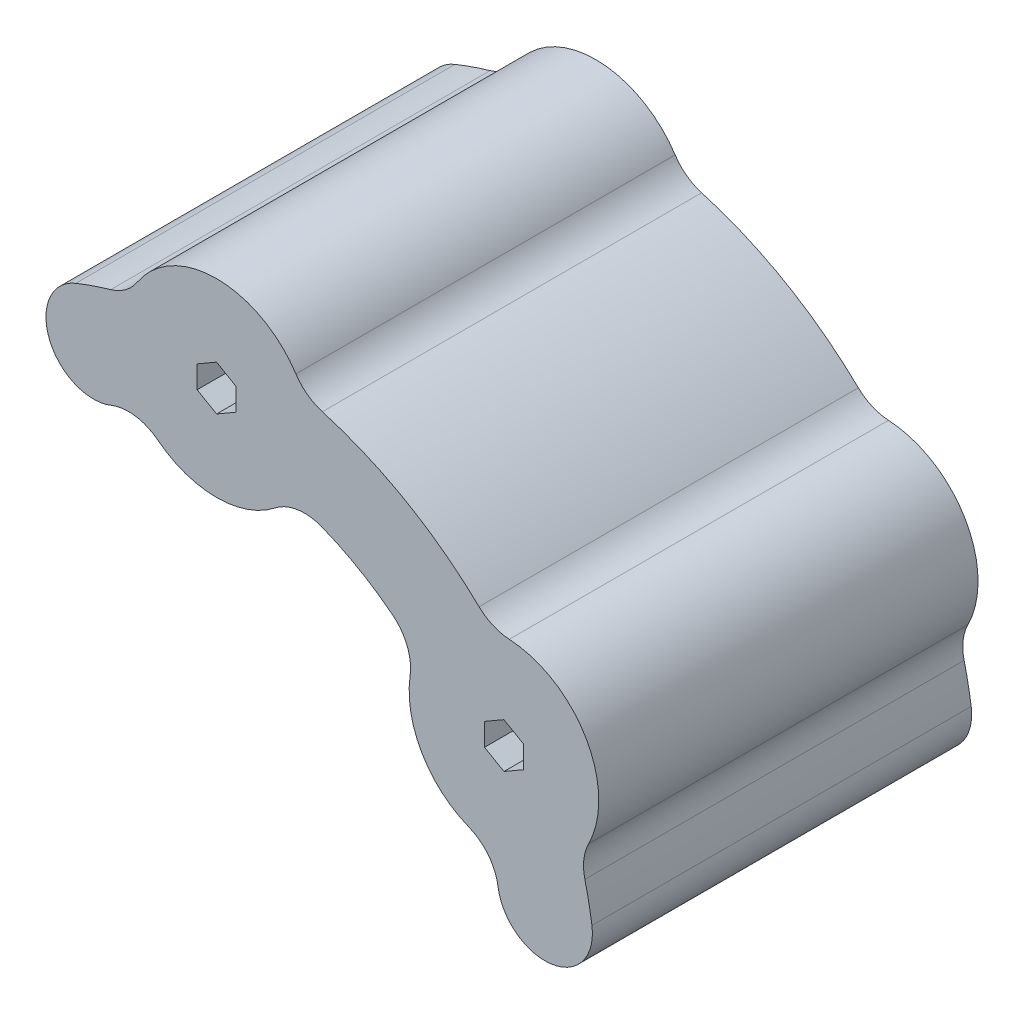
ISO-10303-21;
HEADER;
FILE_DESCRIPTION(('STEP AP214'),'2;1');
FILE_NAME('part.step','',(''),(''),'','','');
FILE_SCHEMA(('AUTOMOTIVE_DESIGN { 1 0 10303 214 1 1 1 1 }'));
ENDSEC;
DATA;
#1=APPLICATION_CONTEXT('core data for automotive mechanical design processes');
#2=APPLICATION_PROTOCOL_DEFINITION('international standard','automotive_design',2000,#1);
#3=PRODUCT_CONTEXT('',#1,'mechanical');
#4=PRODUCT('Part','Part','',(#3));
#5=PRODUCT_RELATED_PRODUCT_CATEGORY('part','',(#4));
#6=PRODUCT_DEFINITION_FORMATION('','',#4);
#7=PRODUCT_DEFINITION_CONTEXT('part definition',#1,'design');
#8=PRODUCT_DEFINITION('design','',#6,#7);
#9=PRODUCT_DEFINITION_SHAPE('','',#8);
#10=(LENGTH_UNIT() NAMED_UNIT(*) SI_UNIT(.MILLI.,.METRE.));
#11=(NAMED_UNIT(*) PLANE_ANGLE_UNIT() SI_UNIT($,.RADIAN.));
#12=(NAMED_UNIT(*) SI_UNIT($,.STERADIAN.) SOLID_ANGLE_UNIT());
#13=UNCERTAINTY_MEASURE_WITH_UNIT(LENGTH_MEASURE(1.E-05),#10,'distance_accuracy_value','');
#14=(GEOMETRIC_REPRESENTATION_CONTEXT(3) GLOBAL_UNCERTAINTY_ASSIGNED_CONTEXT((#13)) GLOBAL_UNIT_ASSIGNED_CONTEXT((#10,
#11,#12)) REPRESENTATION_CONTEXT('',''));
#15=CARTESIAN_POINT('',(0.,0.,0.));
#16=DIRECTION('',(0.,0.,1.));
#17=DIRECTION('',(1.,0.,0.));
#18=AXIS2_PLACEMENT_3D('',#15,#16,#17);
#19=CARTESIAN_POINT('',(0.,0.,80.));
#20=DIRECTION('',(0.,0.,-1.));
#21=DIRECTION('',(-1.,0.,0.));
#22=AXIS2_PLACEMENT_3D('',#19,#20,#21);
#23=CYLINDRICAL_SURFACE('',#22,80.);
#24=CARTESIAN_POINT('',(0.,0.,80.));
#25=DIRECTION('',(0.,0.,1.));
#26=DIRECTION('',(1.,0.,0.));
#27=AXIS2_PLACEMENT_3D('',#24,#25,#26);
#28=CIRCLE('',#27,80.);
#29=CARTESIAN_POINT('',(55.3763748997533,57.736098785439,80.));
#30=VERTEX_POINT('',#29);
#31=CARTESIAN_POINT('',(22.3127408137214,76.8253968253968,80.));
#32=VERTEX_POINT('',#31);
#33=EDGE_CURVE('E355',#30,#32,#28,.T.);
#34=ORIENTED_EDGE('',*,*,#33,.F.);
#35=DIRECTION('',(0.,0.,-1.));
#36=VECTOR('',#35,1.);
#37=CARTESIAN_POINT('',(55.3763748997533,57.736098785439,80.));
#38=LINE('',#37,#36);
#39=CARTESIAN_POINT('',(55.3763748997533,57.736098785439,0.));
#40=VERTEX_POINT('',#39);
#41=EDGE_CURVE('E390',#30,#40,#38,.T.);
#42=ORIENTED_EDGE('',*,*,#41,.T.);
#43=CARTESIAN_POINT('',(0.,0.,0.));
#44=DIRECTION('',(0.,0.,1.));
#45=DIRECTION('',(1.,0.,0.));
#46=AXIS2_PLACEMENT_3D('',#43,#44,#45);
#47=CIRCLE('',#46,80.);
#48=CARTESIAN_POINT('',(22.3127408137214,76.8253968253968,0.));
#49=VERTEX_POINT('',#48);
#50=EDGE_CURVE('E360',#40,#49,#47,.T.);
#51=ORIENTED_EDGE('',*,*,#50,.T.);
#52=DIRECTION('',(0.,0.,-1.));
#53=VECTOR('',#52,1.);
#54=CARTESIAN_POINT('',(22.3127408137214,76.8253968253968,80.));
#55=LINE('',#54,#53);
#56=EDGE_CURVE('E387',#49,#32,#55,.F.);
#57=ORIENTED_EDGE('',*,*,#56,.T.);
#58=EDGE_LOOP('',(#34,#42,#51,#57));
#59=FACE_BOUND('',#58,.T.);
#60=ADVANCED_FACE('F41',(#59),#23,.T.);
#61=CARTESIAN_POINT('',(79.179465488863,11.4285714285712,80.));
#62=VERTEX_POINT('',#61);
#63=CARTESIAN_POINT('',(77.6891157134747,19.0892980399578,80.));
#64=VERTEX_POINT('',#63);
#65=EDGE_CURVE('E357',#62,#64,#28,.T.);
#66=ORIENTED_EDGE('',*,*,#65,.F.);
#67=DIRECTION('',(0.,0.,-1.));
#68=VECTOR('',#67,1.);
#69=CARTESIAN_POINT('',(79.179465488863,11.4285714285712,80.));
#70=LINE('',#69,#68);
#71=CARTESIAN_POINT('',(79.179465488863,11.4285714285712,0.));
#72=VERTEX_POINT('',#71);
#73=EDGE_CURVE('E381',#62,#72,#70,.T.);
#74=ORIENTED_EDGE('',*,*,#73,.T.);
#75=CARTESIAN_POINT('',(77.6891157134747,19.0892980399578,0.));
#76=VERTEX_POINT('',#75);
#77=EDGE_CURVE('E356',#72,#76,#47,.T.);
#78=ORIENTED_EDGE('',*,*,#77,.T.);
#79=DIRECTION('',(0.,0.,-1.));
#80=VECTOR('',#79,1.);
#81=CARTESIAN_POINT('',(77.6891157134747,19.0892980399578,80.));
#82=LINE('',#81,#80);
#83=EDGE_CURVE('E378',#76,#64,#82,.F.);
#84=ORIENTED_EDGE('',*,*,#83,.T.);
#85=EDGE_LOOP('',(#66,#74,#78,#84));
#86=FACE_BOUND('',#85,.T.);
#87=ADVANCED_FACE('F547',(#86),#23,.T.);
#88=CARTESIAN_POINT('',(0.,0.,80.));
#89=DIRECTION('',(0.,0.,-1.));
#90=DIRECTION('',(-1.,0.,0.));
#91=AXIS2_PLACEMENT_3D('',#88,#89,#90);
#92=CYLINDRICAL_SURFACE('',#91,60.);
#93=CARTESIAN_POINT('',(0.,0.,80.));
#94=DIRECTION('',(0.,0.,1.));
#95=DIRECTION('',(1.,0.,0.));
#96=AXIS2_PLACEMENT_3D('',#93,#94,#95);
#97=CIRCLE('',#96,60.);
#98=CARTESIAN_POINT('',(37.1153744479045,47.1428571428571,80.));
#99=VERTEX_POINT('',#98);
#100=CARTESIAN_POINT('',(22.2692246687427,55.7142857142857,80.));
#101=VERTEX_POINT('',#100);
#102=EDGE_CURVE('E346',#99,#101,#97,.T.);
#103=ORIENTED_EDGE('',*,*,#102,.T.);
#104=DIRECTION('',(0.,0.,-1.));
#105=VECTOR('',#104,1.);
#106=CARTESIAN_POINT('',(22.2692246687427,55.7142857142857,80.));
#107=LINE('',#106,#105);
#108=CARTESIAN_POINT('',(22.2692246687427,55.7142857142857,0.));
#109=VERTEX_POINT('',#108);
#110=EDGE_CURVE('E409',#101,#109,#107,.T.);
#111=ORIENTED_EDGE('',*,*,#110,.T.);
#112=CARTESIAN_POINT('',(0.,0.,0.));
#113=DIRECTION('',(0.,0.,1.));
#114=DIRECTION('',(1.,0.,0.));
#115=AXIS2_PLACEMENT_3D('',#112,#113,#114);
#116=CIRCLE('',#115,60.);
#117=CARTESIAN_POINT('',(37.1153744479045,47.1428571428571,0.));
#118=VERTEX_POINT('',#117);
#119=EDGE_CURVE('E335',#118,#109,#116,.T.);
#120=ORIENTED_EDGE('',*,*,#119,.F.);
#121=DIRECTION('',(0.,0.,-1.));
#122=VECTOR('',#121,1.);
#123=CARTESIAN_POINT('',(37.1153744479045,47.1428571428571,80.));
#124=LINE('',#123,#122);
#125=EDGE_CURVE('E407',#118,#99,#124,.F.);
#126=ORIENTED_EDGE('',*,*,#125,.T.);
#127=EDGE_LOOP('',(#103,#111,#120,#126));
#128=FACE_BOUND('',#127,.T.);
#129=ADVANCED_FACE('F553',(#128),#92,.F.);
#130=CARTESIAN_POINT('',(0.,0.,80.));
#131=DIRECTION('',(0.,0.,1.));
#132=DIRECTION('',(1.,0.,0.));
#133=AXIS2_PLACEMENT_3D('',#130,#131,#132);
#134=PLANE('',#133);
#135=CARTESIAN_POINT('',(60.6217782649107,35.,80.));
#136=DIRECTION('',(0.,0.,1.));
#137=DIRECTION('',(1.,0.,0.));
#138=AXIS2_PLACEMENT_3D('',#135,#136,#137);
#139=CIRCLE('',#138,20.);
#140=CARTESIAN_POINT('',(40.826911892695,37.8571428571429,80.));
#141=VERTEX_POINT('',#140);
#142=CARTESIAN_POINT('',(53.1987033753298,16.4285714285714,80.));
#143=VERTEX_POINT('',#142);
#144=EDGE_CURVE('E505',#141,#143,#139,.T.);
#145=ORIENTED_EDGE('',*,*,#144,.T.);
#146=CARTESIAN_POINT('',(49.4871659305393,7.14285714285716,80.));
#147=DIRECTION('',(0.,0.,1.));
#148=DIRECTION('',(1.,0.,0.));
#149=AXIS2_PLACEMENT_3D('',#146,#147,#148);
#150=CIRCLE('',#149,10.);
#151=CARTESIAN_POINT('',(59.3845991166472,8.57142857142844,80.));
#152=VERTEX_POINT('',#151);
#153=EDGE_CURVE('E50',#143,#152,#150,.F.);
#154=ORIENTED_EDGE('',*,*,#153,.T.);
#155=CARTESIAN_POINT('',(69.2820323027551,9.99999999999984,80.));
#156=DIRECTION('',(0.,0.,1.));
#157=DIRECTION('',(1.,0.,0.));
#158=AXIS2_PLACEMENT_3D('',#155,#156,#157);
#159=CIRCLE('',#158,10.);
#160=CARTESIAN_POINT('',(69.2820323027551,-1.57682940283452E-13,80.));
#161=VERTEX_POINT('',#160);
#162=EDGE_CURVE('E58',#152,#161,#159,.T.);
#163=ORIENTED_EDGE('',*,*,#162,.T.);
#164=CARTESIAN_POINT('',(69.2820323027551,9.99999999999984,80.));
#165=DIRECTION('',(0.,0.,1.));
#166=DIRECTION('',(1.,0.,0.));
#167=AXIS2_PLACEMENT_3D('',#164,#165,#166);
#168=CIRCLE('',#167,10.);
#169=EDGE_CURVE('E375',#161,#62,#168,.T.);
#170=ORIENTED_EDGE('',*,*,#169,.T.);
#171=ORIENTED_EDGE('',*,*,#65,.T.);
#172=CARTESIAN_POINT('',(87.400255177659,21.4754602949525,80.));
#173=DIRECTION('',(0.,0.,1.));
#174=DIRECTION('',(1.,0.,0.));
#175=AXIS2_PLACEMENT_3D('',#172,#173,#174);
#176=CIRCLE('',#175,10.);
#177=CARTESIAN_POINT('',(78.4740962067429,25.983640196635,80.));
#178=VERTEX_POINT('',#177);
#179=EDGE_CURVE('E416',#64,#178,#176,.F.);
#180=ORIENTED_EDGE('',*,*,#179,.T.);
#181=CARTESIAN_POINT('',(61.7395405964519,54.9687407557459,80.));
#182=VERTEX_POINT('',#181);
#183=EDGE_CURVE('E508',#178,#182,#139,.T.);
#184=ORIENTED_EDGE('',*,*,#183,.T.);
#185=CARTESIAN_POINT('',(62.2984217622225,64.9531111336189,80.));
#186=DIRECTION('',(0.,0.,1.));
#187=DIRECTION('',(1.,0.,0.));
#188=AXIS2_PLACEMENT_3D('',#185,#186,#187);
#189=CIRCLE('',#188,10.);
#190=EDGE_CURVE('E422',#182,#30,#189,.F.);
#191=ORIENTED_EDGE('',*,*,#190,.T.);
#192=ORIENTED_EDGE('',*,*,#33,.T.);
#193=CARTESIAN_POINT('',(25.1018334154366,86.4285714285714,80.));
#194=DIRECTION('',(0.,0.,1.));
#195=DIRECTION('',(1.,0.,0.));
#196=AXIS2_PLACEMENT_3D('',#193,#194,#195);
#197=CIRCLE('',#196,10.);
#198=CARTESIAN_POINT('',(16.7345556102911,80.9523809523809,80.));
#199=VERTEX_POINT('',#198);
#200=EDGE_CURVE('E424',#32,#199,#197,.F.);
#201=ORIENTED_EDGE('',*,*,#200,.T.);
#202=CARTESIAN_POINT('',(0.,70.,80.));
#203=DIRECTION('',(0.,0.,1.));
#204=DIRECTION('',(1.,0.,0.));
#205=AXIS2_PLACEMENT_3D('',#202,#203,#204);
#206=CIRCLE('',#205,20.);
#207=CARTESIAN_POINT('',(-16.7345556102911,80.9523809523809,80.));
#208=VERTEX_POINT('',#207);
#209=EDGE_CURVE('E493',#199,#208,#206,.T.);
#210=ORIENTED_EDGE('',*,*,#209,.T.);
#211=CARTESIAN_POINT('',(-25.1018334154366,86.4285714285714,80.));
#212=DIRECTION('',(0.,0.,1.));
#213=DIRECTION('',(1.,0.,0.));
#214=AXIS2_PLACEMENT_3D('',#211,#212,#213);
#215=CIRCLE('',#214,10.);
#216=CARTESIAN_POINT('',(-22.3127408137214,76.8253968253968,80.));
#217=VERTEX_POINT('',#216);
#218=EDGE_CURVE('E430',#208,#217,#215,.F.);
#219=ORIENTED_EDGE('',*,*,#218,.T.);
#220=CARTESIAN_POINT('',(-29.6922995583238,74.2857142857142,80.));
#221=VERTEX_POINT('',#220);
#222=EDGE_CURVE('E352',#217,#221,#28,.T.);
#223=ORIENTED_EDGE('',*,*,#222,.T.);
#224=CARTESIAN_POINT('',(-25.9807621135333,64.9999999999999,80.));
#225=DIRECTION('',(0.,0.,1.));
#226=DIRECTION('',(1.,0.,0.));
#227=AXIS2_PLACEMENT_3D('',#224,#225,#226);
#228=CIRCLE('',#227,10.);
#229=CARTESIAN_POINT('',(-34.6410161513777,59.9999999999999,80.));
#230=VERTEX_POINT('',#229);
#231=EDGE_CURVE('E370',#221,#230,#228,.T.);
#232=ORIENTED_EDGE('',*,*,#231,.T.);
#233=CARTESIAN_POINT('',(-25.9807621135333,64.9999999999999,80.));
#234=DIRECTION('',(0.,0.,1.));
#235=DIRECTION('',(1.,0.,0.));
#236=AXIS2_PLACEMENT_3D('',#233,#234,#235);
#237=CIRCLE('',#236,10.);
#238=CARTESIAN_POINT('',(-22.2692246687428,55.7142857142857,80.));
#239=VERTEX_POINT('',#238);
#240=EDGE_CURVE('E372',#230,#239,#237,.T.);
#241=ORIENTED_EDGE('',*,*,#240,.T.);
#242=CARTESIAN_POINT('',(-18.5576872239522,46.4285714285714,80.));
#243=DIRECTION('',(0.,0.,1.));
#244=DIRECTION('',(1.,0.,0.));
#245=AXIS2_PLACEMENT_3D('',#242,#243,#244);
#246=CIRCLE('',#245,10.);
#247=CARTESIAN_POINT('',(-12.3717914826348,54.2857142857143,80.));
#248=VERTEX_POINT('',#247);
#249=EDGE_CURVE('E434',#239,#248,#246,.F.);
#250=ORIENTED_EDGE('',*,*,#249,.T.);
#251=CARTESIAN_POINT('',(12.3717914826348,54.2857142857143,80.));
#252=VERTEX_POINT('',#251);
#253=EDGE_CURVE('E501',#248,#252,#206,.T.);
#254=ORIENTED_EDGE('',*,*,#253,.T.);
#255=CARTESIAN_POINT('',(18.5576872239522,46.4285714285714,80.));
#256=DIRECTION('',(0.,0.,1.));
#257=DIRECTION('',(1.,0.,0.));
#258=AXIS2_PLACEMENT_3D('',#255,#256,#257);
#259=CIRCLE('',#258,10.);
#260=EDGE_CURVE('E436',#252,#101,#259,.F.);
#261=ORIENTED_EDGE('',*,*,#260,.T.);
#262=ORIENTED_EDGE('',*,*,#102,.F.);
#263=CARTESIAN_POINT('',(30.9294787065871,39.2857142857143,80.));
#264=DIRECTION('',(0.,0.,1.));
#265=DIRECTION('',(1.,0.,0.));
#266=AXIS2_PLACEMENT_3D('',#263,#264,#265);
#267=CIRCLE('',#266,10.);
#268=EDGE_CURVE('E442',#99,#141,#267,.F.);
#269=ORIENTED_EDGE('',*,*,#268,.T.);
#270=EDGE_LOOP('',(#145,#154,#163,#170,#171,#180,#184,#191,#192,#201,#210,#219,#223,#232,#241,
#250,#254,#261,#262,#269));
#271=FACE_BOUND('',#270,.T.);
#272=DIRECTION('',(0.866025403784439,-0.5,0.));
#273=VECTOR('',#272,1.);
#274=CARTESIAN_POINT('',(56.5217782649107,32.6328638963225,80.));
#275=LINE('',#274,#273);
#276=CARTESIAN_POINT('',(56.5217782649107,32.6328638963225,80.));
#277=VERTEX_POINT('',#276);
#278=CARTESIAN_POINT('',(60.6217782649107,30.2657277926451,80.));
#279=VERTEX_POINT('',#278);
#280=EDGE_CURVE('E276',#277,#279,#275,.T.);
#281=ORIENTED_EDGE('',*,*,#280,.F.);
#282=DIRECTION('',(0.,-1.,0.));
#283=VECTOR('',#282,1.);
#284=CARTESIAN_POINT('',(56.5217782649107,37.3671361036775,80.));
#285=LINE('',#284,#283);
#286=CARTESIAN_POINT('',(56.5217782649107,37.3671361036775,80.));
#287=VERTEX_POINT('',#286);
#288=EDGE_CURVE('E304',#287,#277,#285,.T.);
#289=ORIENTED_EDGE('',*,*,#288,.F.);
#290=DIRECTION('',(-0.866025403784439,-0.5,0.));
#291=VECTOR('',#290,1.);
#292=CARTESIAN_POINT('',(60.6217782649107,39.7342722073549,80.));
#293=LINE('',#292,#291);
#294=CARTESIAN_POINT('',(60.6217782649107,39.7342722073549,80.));
#295=VERTEX_POINT('',#294);
#296=EDGE_CURVE('E328',#295,#287,#293,.T.);
#297=ORIENTED_EDGE('',*,*,#296,.F.);
#298=DIRECTION('',(-0.866025403784438,0.500000000000001,0.));
#299=VECTOR('',#298,1.);
#300=CARTESIAN_POINT('',(64.7217782649107,37.3671361036775,80.));
#301=LINE('',#300,#299);
#302=CARTESIAN_POINT('',(64.7217782649107,37.3671361036775,80.));
#303=VERTEX_POINT('',#302);
#304=EDGE_CURVE('E325',#303,#295,#301,.T.);
#305=ORIENTED_EDGE('',*,*,#304,.F.);
#306=DIRECTION('',(0.,1.,0.));
#307=VECTOR('',#306,1.);
#308=CARTESIAN_POINT('',(64.7217782649107,32.6328638963225,80.));
#309=LINE('',#308,#307);
#310=CARTESIAN_POINT('',(64.7217782649107,32.6328638963225,80.));
#311=VERTEX_POINT('',#310);
#312=EDGE_CURVE('E322',#311,#303,#309,.T.);
#313=ORIENTED_EDGE('',*,*,#312,.F.);
#314=DIRECTION('',(0.866025403784438,0.500000000000001,0.));
#315=VECTOR('',#314,1.);
#316=CARTESIAN_POINT('',(60.6217782649107,30.2657277926451,80.));
#317=LINE('',#316,#315);
#318=EDGE_CURVE('E278',#279,#311,#317,.T.);
#319=ORIENTED_EDGE('',*,*,#318,.F.);
#320=EDGE_LOOP('',(#281,#289,#297,#305,#313,#319));
#321=FACE_BOUND('',#320,.T.);
#322=DIRECTION('',(0.866025403784439,0.5,0.));
#323=VECTOR('',#322,1.);
#324=CARTESIAN_POINT('',(0.,65.2657277926451,80.));
#325=LINE('',#324,#323);
#326=CARTESIAN_POINT('',(0.,65.2657277926451,80.));
#327=VERTEX_POINT('',#326);
#328=CARTESIAN_POINT('',(4.1,67.6328638963225,80.));
#329=VERTEX_POINT('',#328);
#330=EDGE_CURVE('E253',#327,#329,#325,.T.);
#331=ORIENTED_EDGE('',*,*,#330,.F.);
#332=DIRECTION('',(0.866025403784438,-0.500000000000001,0.));
#333=VECTOR('',#332,1.);
#334=CARTESIAN_POINT('',(-4.1,67.6328638963225,80.));
#335=LINE('',#334,#333);
#336=CARTESIAN_POINT('',(-4.1,67.6328638963225,80.));
#337=VERTEX_POINT('',#336);
#338=EDGE_CURVE('E264',#337,#327,#335,.T.);
#339=ORIENTED_EDGE('',*,*,#338,.F.);
#340=DIRECTION('',(0.,-1.,0.));
#341=VECTOR('',#340,1.);
#342=CARTESIAN_POINT('',(-4.1,72.3671361036775,80.));
#343=LINE('',#342,#341);
#344=CARTESIAN_POINT('',(-4.1,72.3671361036775,80.));
#345=VERTEX_POINT('',#344);
#346=EDGE_CURVE('E269',#345,#337,#343,.T.);
#347=ORIENTED_EDGE('',*,*,#346,.F.);
#348=DIRECTION('',(-0.866025403784439,-0.5,0.));
#349=VECTOR('',#348,1.);
#350=CARTESIAN_POINT('',(0.,74.7342722073549,80.));
#351=LINE('',#350,#349);
#352=CARTESIAN_POINT('',(0.,74.7342722073549,80.));
#353=VERTEX_POINT('',#352);
#354=EDGE_CURVE('E521',#353,#345,#351,.T.);
#355=ORIENTED_EDGE('',*,*,#354,.F.);
#356=DIRECTION('',(-0.866025403784439,0.499999999999999,0.));
#357=VECTOR('',#356,1.);
#358=CARTESIAN_POINT('',(4.1,72.3671361036775,80.));
#359=LINE('',#358,#357);
#360=CARTESIAN_POINT('',(4.1,72.3671361036775,80.));
#361=VERTEX_POINT('',#360);
#362=EDGE_CURVE('E280',#361,#353,#359,.T.);
#363=ORIENTED_EDGE('',*,*,#362,.F.);
#364=DIRECTION('',(0.,1.,0.));
#365=VECTOR('',#364,1.);
#366=CARTESIAN_POINT('',(4.1,67.6328638963225,80.));
#367=LINE('',#366,#365);
#368=EDGE_CURVE('E275',#329,#361,#367,.T.);
#369=ORIENTED_EDGE('',*,*,#368,.F.);
#370=EDGE_LOOP('',(#331,#339,#347,#355,#363,#369));
#371=FACE_BOUND('',#370,.T.);
#372=ADVANCED_FACE('F272',(#271,#321,#371),#134,.T.);
#373=CARTESIAN_POINT('',(0.,0.,0.));
#374=DIRECTION('',(0.,0.,1.));
#375=DIRECTION('',(1.,0.,0.));
#376=AXIS2_PLACEMENT_3D('',#373,#374,#375);
#377=PLANE('',#376);
#378=CARTESIAN_POINT('',(69.2820323027551,9.99999999999984,0.));
#379=DIRECTION('',(0.,0.,1.));
#380=DIRECTION('',(1.,0.,0.));
#381=AXIS2_PLACEMENT_3D('',#378,#379,#380);
#382=CIRCLE('',#381,10.);
#383=CARTESIAN_POINT('',(69.2820323027551,-1.57682940283452E-13,0.));
#384=VERTEX_POINT('',#383);
#385=EDGE_CURVE('E365',#72,#384,#382,.F.);
#386=ORIENTED_EDGE('',*,*,#385,.T.);
#387=CARTESIAN_POINT('',(69.2820323027551,9.99999999999984,0.));
#388=DIRECTION('',(0.,0.,1.));
#389=DIRECTION('',(1.,0.,0.));
#390=AXIS2_PLACEMENT_3D('',#387,#388,#389);
#391=CIRCLE('',#390,10.);
#392=CARTESIAN_POINT('',(59.3845991166472,8.57142857142844,0.));
#393=VERTEX_POINT('',#392);
#394=EDGE_CURVE('E367',#384,#393,#391,.F.);
#395=ORIENTED_EDGE('',*,*,#394,.T.);
#396=CARTESIAN_POINT('',(49.4871659305393,7.14285714285716,0.));
#397=DIRECTION('',(0.,0.,1.));
#398=DIRECTION('',(1.,0.,0.));
#399=AXIS2_PLACEMENT_3D('',#396,#397,#398);
#400=CIRCLE('',#399,10.);
#401=CARTESIAN_POINT('',(53.1987033753298,16.4285714285714,0.));
#402=VERTEX_POINT('',#401);
#403=EDGE_CURVE('E11',#393,#402,#400,.T.);
#404=ORIENTED_EDGE('',*,*,#403,.T.);
#405=CARTESIAN_POINT('',(60.6217782649107,35.,0.));
#406=DIRECTION('',(0.,0.,1.));
#407=DIRECTION('',(1.,0.,0.));
#408=AXIS2_PLACEMENT_3D('',#405,#406,#407);
#409=CIRCLE('',#408,20.);
#410=CARTESIAN_POINT('',(40.826911892695,37.8571428571429,0.));
#411=VERTEX_POINT('',#410);
#412=EDGE_CURVE('E511',#411,#402,#409,.T.);
#413=ORIENTED_EDGE('',*,*,#412,.F.);
#414=CARTESIAN_POINT('',(30.9294787065871,39.2857142857143,0.));
#415=DIRECTION('',(0.,0.,1.));
#416=DIRECTION('',(1.,0.,0.));
#417=AXIS2_PLACEMENT_3D('',#414,#415,#416);
#418=CIRCLE('',#417,10.);
#419=EDGE_CURVE('E440',#411,#118,#418,.T.);
#420=ORIENTED_EDGE('',*,*,#419,.T.);
#421=ORIENTED_EDGE('',*,*,#119,.T.);
#422=CARTESIAN_POINT('',(18.5576872239522,46.4285714285714,0.));
#423=DIRECTION('',(0.,0.,1.));
#424=DIRECTION('',(1.,0.,0.));
#425=AXIS2_PLACEMENT_3D('',#422,#423,#424);
#426=CIRCLE('',#425,10.);
#427=CARTESIAN_POINT('',(12.3717914826348,54.2857142857143,0.));
#428=VERTEX_POINT('',#427);
#429=EDGE_CURVE('E438',#109,#428,#426,.T.);
#430=ORIENTED_EDGE('',*,*,#429,.T.);
#431=CARTESIAN_POINT('',(0.,70.,0.));
#432=DIRECTION('',(0.,0.,1.));
#433=DIRECTION('',(1.,0.,0.));
#434=AXIS2_PLACEMENT_3D('',#431,#432,#433);
#435=CIRCLE('',#434,20.);
#436=CARTESIAN_POINT('',(-12.3717914826348,54.2857142857143,0.));
#437=VERTEX_POINT('',#436);
#438=EDGE_CURVE('E500',#437,#428,#435,.T.);
#439=ORIENTED_EDGE('',*,*,#438,.F.);
#440=CARTESIAN_POINT('',(-18.5576872239522,46.4285714285714,0.));
#441=DIRECTION('',(0.,0.,1.));
#442=DIRECTION('',(1.,0.,0.));
#443=AXIS2_PLACEMENT_3D('',#440,#441,#442);
#444=CIRCLE('',#443,10.);
#445=CARTESIAN_POINT('',(-22.2692246687428,55.7142857142857,0.));
#446=VERTEX_POINT('',#445);
#447=EDGE_CURVE('E432',#437,#446,#444,.T.);
#448=ORIENTED_EDGE('',*,*,#447,.T.);
#449=CARTESIAN_POINT('',(-25.9807621135333,64.9999999999999,0.));
#450=DIRECTION('',(0.,0.,1.));
#451=DIRECTION('',(1.,0.,0.));
#452=AXIS2_PLACEMENT_3D('',#449,#450,#451);
#453=CIRCLE('',#452,10.);
#454=CARTESIAN_POINT('',(-34.6410161513777,59.9999999999999,0.));
#455=VERTEX_POINT('',#454);
#456=EDGE_CURVE('E363',#446,#455,#453,.F.);
#457=ORIENTED_EDGE('',*,*,#456,.T.);
#458=CARTESIAN_POINT('',(-25.9807621135333,64.9999999999999,0.));
#459=DIRECTION('',(0.,0.,1.));
#460=DIRECTION('',(1.,0.,0.));
#461=AXIS2_PLACEMENT_3D('',#458,#459,#460);
#462=CIRCLE('',#461,10.);
#463=CARTESIAN_POINT('',(-29.6922995583238,74.2857142857142,0.));
#464=VERTEX_POINT('',#463);
#465=EDGE_CURVE('E361',#455,#464,#462,.F.);
#466=ORIENTED_EDGE('',*,*,#465,.T.);
#467=CARTESIAN_POINT('',(-22.3127408137214,76.8253968253968,0.));
#468=VERTEX_POINT('',#467);
#469=EDGE_CURVE('E349',#468,#464,#47,.T.);
#470=ORIENTED_EDGE('',*,*,#469,.F.);
#471=CARTESIAN_POINT('',(-25.1018334154366,86.4285714285714,0.));
#472=DIRECTION('',(0.,0.,1.));
#473=DIRECTION('',(1.,0.,0.));
#474=AXIS2_PLACEMENT_3D('',#471,#472,#473);
#475=CIRCLE('',#474,10.);
#476=CARTESIAN_POINT('',(-16.7345556102911,80.9523809523809,0.));
#477=VERTEX_POINT('',#476);
#478=EDGE_CURVE('E428',#468,#477,#475,.T.);
#479=ORIENTED_EDGE('',*,*,#478,.T.);
#480=CARTESIAN_POINT('',(16.7345556102911,80.9523809523809,0.));
#481=VERTEX_POINT('',#480);
#482=EDGE_CURVE('E261',#481,#477,#435,.T.);
#483=ORIENTED_EDGE('',*,*,#482,.F.);
#484=CARTESIAN_POINT('',(25.1018334154366,86.4285714285714,0.));
#485=DIRECTION('',(0.,0.,1.));
#486=DIRECTION('',(1.,0.,0.));
#487=AXIS2_PLACEMENT_3D('',#484,#485,#486);
#488=CIRCLE('',#487,10.);
#489=EDGE_CURVE('E426',#481,#49,#488,.T.);
#490=ORIENTED_EDGE('',*,*,#489,.T.);
#491=ORIENTED_EDGE('',*,*,#50,.F.);
#492=CARTESIAN_POINT('',(62.2984217622225,64.9531111336189,0.));
#493=DIRECTION('',(0.,0.,1.));
#494=DIRECTION('',(1.,0.,0.));
#495=AXIS2_PLACEMENT_3D('',#492,#493,#494);
#496=CIRCLE('',#495,10.);
#497=CARTESIAN_POINT('',(61.7395405964519,54.9687407557459,0.));
#498=VERTEX_POINT('',#497);
#499=EDGE_CURVE('E420',#40,#498,#496,.T.);
#500=ORIENTED_EDGE('',*,*,#499,.T.);
#501=CARTESIAN_POINT('',(78.4740962067429,25.983640196635,0.));
#502=VERTEX_POINT('',#501);
#503=EDGE_CURVE('E449',#502,#498,#409,.T.);
#504=ORIENTED_EDGE('',*,*,#503,.F.);
#505=CARTESIAN_POINT('',(87.400255177659,21.4754602949525,0.));
#506=DIRECTION('',(0.,0.,1.));
#507=DIRECTION('',(1.,0.,0.));
#508=AXIS2_PLACEMENT_3D('',#505,#506,#507);
#509=CIRCLE('',#508,10.);
#510=EDGE_CURVE('E418',#502,#76,#509,.T.);
#511=ORIENTED_EDGE('',*,*,#510,.T.);
#512=ORIENTED_EDGE('',*,*,#77,.F.);
#513=EDGE_LOOP('',(#386,#395,#404,#413,#420,#421,#430,#439,#448,#457,#466,#470,#479,#483,#490,
#491,#500,#504,#511,#512));
#514=FACE_BOUND('',#513,.T.);
#515=DIRECTION('',(0.,-1.,0.));
#516=VECTOR('',#515,1.);
#517=CARTESIAN_POINT('',(56.5217782649107,37.3671361036775,0.));
#518=LINE('',#517,#516);
#519=CARTESIAN_POINT('',(56.5217782649107,37.3671361036775,0.));
#520=VERTEX_POINT('',#519);
#521=CARTESIAN_POINT('',(56.5217782649107,32.6328638963225,0.));
#522=VERTEX_POINT('',#521);
#523=EDGE_CURVE('E316',#520,#522,#518,.T.);
#524=ORIENTED_EDGE('',*,*,#523,.T.);
#525=DIRECTION('',(0.866025403784439,-0.5,0.));
#526=VECTOR('',#525,1.);
#527=CARTESIAN_POINT('',(56.5217782649107,32.6328638963225,0.));
#528=LINE('',#527,#526);
#529=CARTESIAN_POINT('',(60.6217782649107,30.2657277926451,0.));
#530=VERTEX_POINT('',#529);
#531=EDGE_CURVE('E300',#522,#530,#528,.T.);
#532=ORIENTED_EDGE('',*,*,#531,.T.);
#533=DIRECTION('',(0.866025403784438,0.500000000000001,0.));
#534=VECTOR('',#533,1.);
#535=CARTESIAN_POINT('',(60.6217782649107,30.2657277926451,0.));
#536=LINE('',#535,#534);
#537=CARTESIAN_POINT('',(64.7217782649107,32.6328638963225,0.));
#538=VERTEX_POINT('',#537);
#539=EDGE_CURVE('E303',#530,#538,#536,.T.);
#540=ORIENTED_EDGE('',*,*,#539,.T.);
#541=DIRECTION('',(0.,1.,0.));
#542=VECTOR('',#541,1.);
#543=CARTESIAN_POINT('',(64.7217782649107,32.6328638963225,0.));
#544=LINE('',#543,#542);
#545=CARTESIAN_POINT('',(64.7217782649107,37.3671361036775,0.));
#546=VERTEX_POINT('',#545);
#547=EDGE_CURVE('E307',#538,#546,#544,.T.);
#548=ORIENTED_EDGE('',*,*,#547,.T.);
#549=DIRECTION('',(-0.866025403784438,0.500000000000001,0.));
#550=VECTOR('',#549,1.);
#551=CARTESIAN_POINT('',(64.7217782649107,37.3671361036775,0.));
#552=LINE('',#551,#550);
#553=CARTESIAN_POINT('',(60.6217782649107,39.7342722073549,0.));
#554=VERTEX_POINT('',#553);
#555=EDGE_CURVE('E310',#546,#554,#552,.T.);
#556=ORIENTED_EDGE('',*,*,#555,.T.);
#557=DIRECTION('',(-0.866025403784439,-0.5,0.));
#558=VECTOR('',#557,1.);
#559=CARTESIAN_POINT('',(60.6217782649107,39.7342722073549,0.));
#560=LINE('',#559,#558);
#561=EDGE_CURVE('E313',#554,#520,#560,.T.);
#562=ORIENTED_EDGE('',*,*,#561,.T.);
#563=EDGE_LOOP('',(#524,#532,#540,#548,#556,#562));
#564=FACE_BOUND('',#563,.T.);
#565=DIRECTION('',(0.866025403784438,-0.500000000000001,0.));
#566=VECTOR('',#565,1.);
#567=CARTESIAN_POINT('',(-4.1,67.6328638963225,0.));
#568=LINE('',#567,#566);
#569=CARTESIAN_POINT('',(-4.1,67.6328638963225,0.));
#570=VERTEX_POINT('',#569);
#571=CARTESIAN_POINT('',(0.,65.2657277926451,0.));
#572=VERTEX_POINT('',#571);
#573=EDGE_CURVE('E284',#570,#572,#568,.T.);
#574=ORIENTED_EDGE('',*,*,#573,.T.);
#575=DIRECTION('',(0.866025403784439,0.5,0.));
#576=VECTOR('',#575,1.);
#577=CARTESIAN_POINT('',(0.,65.2657277926451,0.));
#578=LINE('',#577,#576);
#579=CARTESIAN_POINT('',(4.1,67.6328638963225,0.));
#580=VERTEX_POINT('',#579);
#581=EDGE_CURVE('E256',#572,#580,#578,.T.);
#582=ORIENTED_EDGE('',*,*,#581,.T.);
#583=DIRECTION('',(0.,1.,0.));
#584=VECTOR('',#583,1.);
#585=CARTESIAN_POINT('',(4.1,67.6328638963225,0.));
#586=LINE('',#585,#584);
#587=CARTESIAN_POINT('',(4.1,72.3671361036775,0.));
#588=VERTEX_POINT('',#587);
#589=EDGE_CURVE('E296',#580,#588,#586,.T.);
#590=ORIENTED_EDGE('',*,*,#589,.T.);
#591=DIRECTION('',(-0.866025403784439,0.499999999999999,0.));
#592=VECTOR('',#591,1.);
#593=CARTESIAN_POINT('',(4.1,72.3671361036775,0.));
#594=LINE('',#593,#592);
#595=CARTESIAN_POINT('',(0.,74.7342722073549,0.));
#596=VERTEX_POINT('',#595);
#597=EDGE_CURVE('E293',#588,#596,#594,.T.);
#598=ORIENTED_EDGE('',*,*,#597,.T.);
#599=DIRECTION('',(-0.866025403784439,-0.5,0.));
#600=VECTOR('',#599,1.);
#601=CARTESIAN_POINT('',(0.,74.7342722073549,0.));
#602=LINE('',#601,#600);
#603=CARTESIAN_POINT('',(-4.1,72.3671361036775,0.));
#604=VERTEX_POINT('',#603);
#605=EDGE_CURVE('E290',#596,#604,#602,.T.);
#606=ORIENTED_EDGE('',*,*,#605,.T.);
#607=DIRECTION('',(0.,-1.,0.));
#608=VECTOR('',#607,1.);
#609=CARTESIAN_POINT('',(-4.1,72.3671361036775,0.));
#610=LINE('',#609,#608);
#611=EDGE_CURVE('E286',#604,#570,#610,.T.);
#612=ORIENTED_EDGE('',*,*,#611,.T.);
#613=EDGE_LOOP('',(#574,#582,#590,#598,#606,#612));
#614=FACE_BOUND('',#613,.T.);
#615=ADVANCED_FACE('F475',(#514,#564,#614),#377,.F.);
#616=ORIENTED_EDGE('',*,*,#222,.F.);
#617=DIRECTION('',(0.,0.,-1.));
#618=VECTOR('',#617,1.);
#619=CARTESIAN_POINT('',(-22.3127408137214,76.8253968253968,80.));
#620=LINE('',#619,#618);
#621=EDGE_CURVE('E399',#217,#468,#620,.T.);
#622=ORIENTED_EDGE('',*,*,#621,.T.);
#623=ORIENTED_EDGE('',*,*,#469,.T.);
#624=DIRECTION('',(0.,0.,-1.));
#625=VECTOR('',#624,1.);
#626=CARTESIAN_POINT('',(-29.6922995583238,74.2857142857142,80.));
#627=LINE('',#626,#625);
#628=EDGE_CURVE('E397',#464,#221,#627,.F.);
#629=ORIENTED_EDGE('',*,*,#628,.T.);
#630=EDGE_LOOP('',(#616,#622,#623,#629));
#631=FACE_BOUND('',#630,.T.);
#632=ADVANCED_FACE('F478',(#631),#23,.T.);
#633=CARTESIAN_POINT('',(56.5217782649107,32.6328638963225,0.));
#634=DIRECTION('',(-0.5,-0.866025403784439,0.));
#635=DIRECTION('',(0.866025403784439,-0.5,0.));
#636=AXIS2_PLACEMENT_3D('',#633,#634,#635);
#637=PLANE('',#636);
#638=ORIENTED_EDGE('',*,*,#280,.T.);
#639=DIRECTION('',(0.,0.,1.));
#640=VECTOR('',#639,1.);
#641=CARTESIAN_POINT('',(60.6217782649107,30.2657277926451,0.));
#642=LINE('',#641,#640);
#643=EDGE_CURVE('E318',#530,#279,#642,.T.);
#644=ORIENTED_EDGE('',*,*,#643,.F.);
#645=ORIENTED_EDGE('',*,*,#531,.F.);
#646=DIRECTION('',(0.,0.,1.));
#647=VECTOR('',#646,1.);
#648=CARTESIAN_POINT('',(56.5217782649107,32.6328638963225,0.));
#649=LINE('',#648,#647);
#650=EDGE_CURVE('E333',#522,#277,#649,.T.);
#651=ORIENTED_EDGE('',*,*,#650,.T.);
#652=EDGE_LOOP('',(#638,#644,#645,#651));
#653=FACE_BOUND('',#652,.T.);
#654=ADVANCED_FACE('F558',(#653),#637,.F.);
#655=CARTESIAN_POINT('',(56.5217782649107,37.3671361036775,0.));
#656=DIRECTION('',(-1.,0.,0.));
#657=DIRECTION('',(0.,0.,1.));
#658=AXIS2_PLACEMENT_3D('',#655,#656,#657);
#659=PLANE('',#658);
#660=ORIENTED_EDGE('',*,*,#288,.T.);
#661=ORIENTED_EDGE('',*,*,#650,.F.);
#662=ORIENTED_EDGE('',*,*,#523,.F.);
#663=DIRECTION('',(0.,0.,1.));
#664=VECTOR('',#663,1.);
#665=CARTESIAN_POINT('',(56.5217782649107,37.3671361036775,0.));
#666=LINE('',#665,#664);
#667=EDGE_CURVE('E336',#520,#287,#666,.T.);
#668=ORIENTED_EDGE('',*,*,#667,.T.);
#669=EDGE_LOOP('',(#660,#661,#662,#668));
#670=FACE_BOUND('',#669,.T.);
#671=ADVANCED_FACE('F564',(#670),#659,.F.);
#672=CARTESIAN_POINT('',(60.6217782649107,39.7342722073549,0.));
#673=DIRECTION('',(-0.5,0.866025403784439,0.));
#674=DIRECTION('',(-0.866025403784439,-0.5,0.));
#675=AXIS2_PLACEMENT_3D('',#672,#673,#674);
#676=PLANE('',#675);
#677=ORIENTED_EDGE('',*,*,#296,.T.);
#678=ORIENTED_EDGE('',*,*,#667,.F.);
#679=ORIENTED_EDGE('',*,*,#561,.F.);
#680=DIRECTION('',(0.,0.,1.));
#681=VECTOR('',#680,1.);
#682=CARTESIAN_POINT('',(60.6217782649107,39.7342722073549,0.));
#683=LINE('',#682,#681);
#684=EDGE_CURVE('E338',#554,#295,#683,.T.);
#685=ORIENTED_EDGE('',*,*,#684,.T.);
#686=EDGE_LOOP('',(#677,#678,#679,#685));
#687=FACE_BOUND('',#686,.T.);
#688=ADVANCED_FACE('F586',(#687),#676,.F.);
#689=CARTESIAN_POINT('',(64.7217782649107,37.3671361036775,0.));
#690=DIRECTION('',(0.500000000000001,0.866025403784438,0.));
#691=DIRECTION('',(-0.866025403784438,0.500000000000001,0.));
#692=AXIS2_PLACEMENT_3D('',#689,#690,#691);
#693=PLANE('',#692);
#694=ORIENTED_EDGE('',*,*,#304,.T.);
#695=ORIENTED_EDGE('',*,*,#684,.F.);
#696=ORIENTED_EDGE('',*,*,#555,.F.);
#697=DIRECTION('',(0.,0.,1.));
#698=VECTOR('',#697,1.);
#699=CARTESIAN_POINT('',(64.7217782649107,37.3671361036775,0.));
#700=LINE('',#699,#698);
#701=EDGE_CURVE('E340',#546,#303,#700,.T.);
#702=ORIENTED_EDGE('',*,*,#701,.T.);
#703=EDGE_LOOP('',(#694,#695,#696,#702));
#704=FACE_BOUND('',#703,.T.);
#705=ADVANCED_FACE('F582',(#704),#693,.F.);
#706=CARTESIAN_POINT('',(64.7217782649107,32.6328638963225,0.));
#707=DIRECTION('',(1.,0.,0.));
#708=DIRECTION('',(0.,1.,0.));
#709=AXIS2_PLACEMENT_3D('',#706,#707,#708);
#710=PLANE('',#709);
#711=ORIENTED_EDGE('',*,*,#312,.T.);
#712=ORIENTED_EDGE('',*,*,#701,.F.);
#713=ORIENTED_EDGE('',*,*,#547,.F.);
#714=DIRECTION('',(0.,0.,1.));
#715=VECTOR('',#714,1.);
#716=CARTESIAN_POINT('',(64.7217782649107,32.6328638963225,0.));
#717=LINE('',#716,#715);
#718=EDGE_CURVE('E342',#538,#311,#717,.T.);
#719=ORIENTED_EDGE('',*,*,#718,.T.);
#720=EDGE_LOOP('',(#711,#712,#713,#719));
#721=FACE_BOUND('',#720,.T.);
#722=ADVANCED_FACE('F578',(#721),#710,.F.);
#723=CARTESIAN_POINT('',(60.6217782649107,30.2657277926451,0.));
#724=DIRECTION('',(0.500000000000001,-0.866025403784438,0.));
#725=DIRECTION('',(0.866025403784438,0.500000000000001,0.));
#726=AXIS2_PLACEMENT_3D('',#723,#724,#725);
#727=PLANE('',#726);
#728=ORIENTED_EDGE('',*,*,#318,.T.);
#729=ORIENTED_EDGE('',*,*,#718,.F.);
#730=ORIENTED_EDGE('',*,*,#539,.F.);
#731=ORIENTED_EDGE('',*,*,#643,.T.);
#732=EDGE_LOOP('',(#728,#729,#730,#731));
#733=FACE_BOUND('',#732,.T.);
#734=ADVANCED_FACE('F575',(#733),#727,.F.);
#735=CARTESIAN_POINT('',(0.,65.2657277926451,0.));
#736=DIRECTION('',(0.5,-0.866025403784439,0.));
#737=DIRECTION('',(0.866025403784439,0.5,0.));
#738=AXIS2_PLACEMENT_3D('',#735,#736,#737);
#739=PLANE('',#738);
#740=ORIENTED_EDGE('',*,*,#330,.T.);
#741=DIRECTION('',(0.,0.,1.));
#742=VECTOR('',#741,1.);
#743=CARTESIAN_POINT('',(4.1,67.6328638963225,0.));
#744=LINE('',#743,#742);
#745=EDGE_CURVE('E287',#580,#329,#744,.T.);
#746=ORIENTED_EDGE('',*,*,#745,.F.);
#747=ORIENTED_EDGE('',*,*,#581,.F.);
#748=DIRECTION('',(0.,0.,1.));
#749=VECTOR('',#748,1.);
#750=CARTESIAN_POINT('',(0.,65.2657277926451,0.));
#751=LINE('',#750,#749);
#752=EDGE_CURVE('E249',#572,#327,#751,.T.);
#753=ORIENTED_EDGE('',*,*,#752,.T.);
#754=EDGE_LOOP('',(#740,#746,#747,#753));
#755=FACE_BOUND('',#754,.T.);
#756=ADVANCED_FACE('F251',(#755),#739,.F.);
#757=CARTESIAN_POINT('',(-4.1,67.6328638963225,0.));
#758=DIRECTION('',(-0.500000000000001,-0.866025403784438,0.));
#759=DIRECTION('',(0.866025403784438,-0.500000000000001,0.));
#760=AXIS2_PLACEMENT_3D('',#757,#758,#759);
#761=PLANE('',#760);
#762=ORIENTED_EDGE('',*,*,#338,.T.);
#763=ORIENTED_EDGE('',*,*,#752,.F.);
#764=ORIENTED_EDGE('',*,*,#573,.F.);
#765=DIRECTION('',(0.,0.,1.));
#766=VECTOR('',#765,1.);
#767=CARTESIAN_POINT('',(-4.1,67.6328638963225,0.));
#768=LINE('',#767,#766);
#769=EDGE_CURVE('E260',#570,#337,#768,.T.);
#770=ORIENTED_EDGE('',*,*,#769,.T.);
#771=EDGE_LOOP('',(#762,#763,#764,#770));
#772=FACE_BOUND('',#771,.T.);
#773=ADVANCED_FACE('F265',(#772),#761,.F.);
#774=CARTESIAN_POINT('',(-4.1,72.3671361036775,0.));
#775=DIRECTION('',(-1.,0.,0.));
#776=DIRECTION('',(0.,-1.,0.));
#777=AXIS2_PLACEMENT_3D('',#774,#775,#776);
#778=PLANE('',#777);
#779=ORIENTED_EDGE('',*,*,#346,.T.);
#780=ORIENTED_EDGE('',*,*,#769,.F.);
#781=ORIENTED_EDGE('',*,*,#611,.F.);
#782=DIRECTION('',(0.,0.,1.));
#783=VECTOR('',#782,1.);
#784=CARTESIAN_POINT('',(-4.1,72.3671361036775,0.));
#785=LINE('',#784,#783);
#786=EDGE_CURVE('E517',#604,#345,#785,.T.);
#787=ORIENTED_EDGE('',*,*,#786,.T.);
#788=EDGE_LOOP('',(#779,#780,#781,#787));
#789=FACE_BOUND('',#788,.T.);
#790=ADVANCED_FACE('F537',(#789),#778,.F.);
#791=CARTESIAN_POINT('',(0.,74.7342722073549,0.));
#792=DIRECTION('',(-0.5,0.866025403784439,0.));
#793=DIRECTION('',(-0.866025403784439,-0.5,0.));
#794=AXIS2_PLACEMENT_3D('',#791,#792,#793);
#795=PLANE('',#794);
#796=ORIENTED_EDGE('',*,*,#354,.T.);
#797=ORIENTED_EDGE('',*,*,#786,.F.);
#798=ORIENTED_EDGE('',*,*,#605,.F.);
#799=DIRECTION('',(0.,0.,1.));
#800=VECTOR('',#799,1.);
#801=CARTESIAN_POINT('',(0.,74.7342722073549,0.));
#802=LINE('',#801,#800);
#803=EDGE_CURVE('E515',#596,#353,#802,.T.);
#804=ORIENTED_EDGE('',*,*,#803,.T.);
#805=EDGE_LOOP('',(#796,#797,#798,#804));
#806=FACE_BOUND('',#805,.T.);
#807=ADVANCED_FACE('F530',(#806),#795,.F.);
#808=CARTESIAN_POINT('',(4.1,72.3671361036775,0.));
#809=DIRECTION('',(0.499999999999999,0.866025403784439,0.));
#810=DIRECTION('',(-0.866025403784439,0.499999999999999,0.));
#811=AXIS2_PLACEMENT_3D('',#808,#809,#810);
#812=PLANE('',#811);
#813=ORIENTED_EDGE('',*,*,#362,.T.);
#814=ORIENTED_EDGE('',*,*,#803,.F.);
#815=ORIENTED_EDGE('',*,*,#597,.F.);
#816=DIRECTION('',(0.,0.,1.));
#817=VECTOR('',#816,1.);
#818=CARTESIAN_POINT('',(4.1,72.3671361036775,0.));
#819=LINE('',#818,#817);
#820=EDGE_CURVE('E513',#588,#361,#819,.T.);
#821=ORIENTED_EDGE('',*,*,#820,.T.);
#822=EDGE_LOOP('',(#813,#814,#815,#821));
#823=FACE_BOUND('',#822,.T.);
#824=ADVANCED_FACE('F526',(#823),#812,.F.);
#825=CARTESIAN_POINT('',(4.1,67.6328638963225,0.));
#826=DIRECTION('',(1.,0.,0.));
#827=DIRECTION('',(0.,0.,-1.));
#828=AXIS2_PLACEMENT_3D('',#825,#826,#827);
#829=PLANE('',#828);
#830=ORIENTED_EDGE('',*,*,#368,.T.);
#831=ORIENTED_EDGE('',*,*,#820,.F.);
#832=ORIENTED_EDGE('',*,*,#589,.F.);
#833=ORIENTED_EDGE('',*,*,#745,.T.);
#834=EDGE_LOOP('',(#830,#831,#832,#833));
#835=FACE_BOUND('',#834,.T.);
#836=ADVANCED_FACE('F535',(#835),#829,.F.);
#837=CARTESIAN_POINT('',(60.6217782649107,35.,0.));
#838=DIRECTION('',(0.,0.,1.));
#839=DIRECTION('',(1.,0.,0.));
#840=AXIS2_PLACEMENT_3D('',#837,#838,#839);
#841=CYLINDRICAL_SURFACE('',#840,20.);
#842=ORIENTED_EDGE('',*,*,#144,.F.);
#843=DIRECTION('',(0.,0.,1.));
#844=VECTOR('',#843,1.);
#845=CARTESIAN_POINT('',(40.826911892695,37.8571428571429,0.));
#846=LINE('',#845,#844);
#847=EDGE_CURVE('E413',#141,#411,#846,.F.);
#848=ORIENTED_EDGE('',*,*,#847,.T.);
#849=ORIENTED_EDGE('',*,*,#412,.T.);
#850=DIRECTION('',(0.,0.,1.));
#851=VECTOR('',#850,1.);
#852=CARTESIAN_POINT('',(53.1987033753298,16.4285714285714,0.));
#853=LINE('',#852,#851);
#854=EDGE_CURVE('E411',#402,#143,#853,.T.);
#855=ORIENTED_EDGE('',*,*,#854,.T.);
#856=EDGE_LOOP('',(#842,#848,#849,#855));
#857=FACE_BOUND('',#856,.T.);
#858=ADVANCED_FACE('F668',(#857),#841,.T.);
#859=CARTESIAN_POINT('',(0.,70.,0.));
#860=DIRECTION('',(0.,0.,1.));
#861=DIRECTION('',(1.,0.,0.));
#862=AXIS2_PLACEMENT_3D('',#859,#860,#861);
#863=CYLINDRICAL_SURFACE('',#862,20.);
#864=ORIENTED_EDGE('',*,*,#253,.F.);
#865=DIRECTION('',(0.,0.,1.));
#866=VECTOR('',#865,1.);
#867=CARTESIAN_POINT('',(-12.3717914826348,54.2857142857143,0.));
#868=LINE('',#867,#866);
#869=EDGE_CURVE('E405',#248,#437,#868,.F.);
#870=ORIENTED_EDGE('',*,*,#869,.T.);
#871=ORIENTED_EDGE('',*,*,#438,.T.);
#872=DIRECTION('',(0.,0.,1.));
#873=VECTOR('',#872,1.);
#874=CARTESIAN_POINT('',(12.3717914826348,54.2857142857143,0.));
#875=LINE('',#874,#873);
#876=EDGE_CURVE('E402',#428,#252,#875,.T.);
#877=ORIENTED_EDGE('',*,*,#876,.T.);
#878=EDGE_LOOP('',(#864,#870,#871,#877));
#879=FACE_BOUND('',#878,.T.);
#880=ADVANCED_FACE('F710',(#879),#863,.T.);
#881=ORIENTED_EDGE('',*,*,#183,.F.);
#882=DIRECTION('',(0.,0.,1.));
#883=VECTOR('',#882,1.);
#884=CARTESIAN_POINT('',(78.4740962067429,25.983640196635,0.));
#885=LINE('',#884,#883);
#886=EDGE_CURVE('E385',#178,#502,#885,.F.);
#887=ORIENTED_EDGE('',*,*,#886,.T.);
#888=ORIENTED_EDGE('',*,*,#503,.T.);
#889=DIRECTION('',(0.,0.,1.));
#890=VECTOR('',#889,1.);
#891=CARTESIAN_POINT('',(61.7395405964519,54.9687407557459,0.));
#892=LINE('',#891,#890);
#893=EDGE_CURVE('E383',#498,#182,#892,.T.);
#894=ORIENTED_EDGE('',*,*,#893,.T.);
#895=EDGE_LOOP('',(#881,#887,#888,#894));
#896=FACE_BOUND('',#895,.T.);
#897=ADVANCED_FACE('F713',(#896),#841,.T.);
#898=ORIENTED_EDGE('',*,*,#209,.F.);
#899=DIRECTION('',(0.,0.,1.));
#900=VECTOR('',#899,1.);
#901=CARTESIAN_POINT('',(16.7345556102911,80.9523809523809,0.));
#902=LINE('',#901,#900);
#903=EDGE_CURVE('E395',#199,#481,#902,.F.);
#904=ORIENTED_EDGE('',*,*,#903,.T.);
#905=ORIENTED_EDGE('',*,*,#482,.T.);
#906=DIRECTION('',(0.,0.,1.));
#907=VECTOR('',#906,1.);
#908=CARTESIAN_POINT('',(-16.7345556102911,80.9523809523809,0.));
#909=LINE('',#908,#907);
#910=EDGE_CURVE('E393',#477,#208,#909,.T.);
#911=ORIENTED_EDGE('',*,*,#910,.T.);
#912=EDGE_LOOP('',(#898,#904,#905,#911));
#913=FACE_BOUND('',#912,.T.);
#914=ADVANCED_FACE('F496',(#913),#863,.T.);
#915=CARTESIAN_POINT('',(49.4871659305393,7.14285714285716,80.));
#916=DIRECTION('',(0.,0.,1.));
#917=DIRECTION('',(1.,0.,0.));
#918=AXIS2_PLACEMENT_3D('',#915,#916,#917);
#919=CYLINDRICAL_SURFACE('',#918,10.);
#920=ORIENTED_EDGE('',*,*,#854,.F.);
#921=ORIENTED_EDGE('',*,*,#403,.F.);
#922=DIRECTION('',(0.,0.,-1.));
#923=VECTOR('',#922,1.);
#924=CARTESIAN_POINT('',(59.3845991166472,8.5714285714286,80.));
#925=LINE('',#924,#923);
#926=EDGE_CURVE('E448',#152,#393,#925,.T.);
#927=ORIENTED_EDGE('',*,*,#926,.F.);
#928=ORIENTED_EDGE('',*,*,#153,.F.);
#929=EDGE_LOOP('',(#920,#921,#927,#928));
#930=FACE_BOUND('',#929,.T.);
#931=ADVANCED_FACE('F738',(#930),#919,.F.);
#932=CARTESIAN_POINT('',(69.2820323027551,9.99999999999984,80.));
#933=DIRECTION('',(0.,0.,-1.));
#934=DIRECTION('',(-1.,0.,0.));
#935=AXIS2_PLACEMENT_3D('',#932,#933,#934);
#936=CYLINDRICAL_SURFACE('',#935,10.);
#937=ORIENTED_EDGE('',*,*,#73,.F.);
#938=ORIENTED_EDGE('',*,*,#169,.F.);
#939=DIRECTION('',(0.,0.,-1.));
#940=VECTOR('',#939,1.);
#941=CARTESIAN_POINT('',(69.2820323027551,-1.57682940283452E-13,0.));
#942=LINE('',#941,#940);
#943=EDGE_CURVE('E445',#384,#161,#942,.F.);
#944=ORIENTED_EDGE('',*,*,#943,.F.);
#945=ORIENTED_EDGE('',*,*,#385,.F.);
#946=EDGE_LOOP('',(#937,#938,#944,#945));
#947=FACE_BOUND('',#946,.T.);
#948=ADVANCED_FACE('F746',(#947),#936,.T.);
#949=CARTESIAN_POINT('',(69.2820323027551,9.99999999999984,80.));
#950=DIRECTION('',(0.,0.,-1.));
#951=DIRECTION('',(-1.,0.,0.));
#952=AXIS2_PLACEMENT_3D('',#949,#950,#951);
#953=CYLINDRICAL_SURFACE('',#952,10.);
#954=ORIENTED_EDGE('',*,*,#162,.F.);
#955=ORIENTED_EDGE('',*,*,#926,.T.);
#956=ORIENTED_EDGE('',*,*,#394,.F.);
#957=ORIENTED_EDGE('',*,*,#943,.T.);
#958=EDGE_LOOP('',(#954,#955,#956,#957));
#959=FACE_BOUND('',#958,.T.);
#960=ADVANCED_FACE('F756',(#959),#953,.T.);
#961=CARTESIAN_POINT('',(87.400255177659,21.4754602949525,0.));
#962=DIRECTION('',(0.,0.,-1.));
#963=DIRECTION('',(-1.,0.,0.));
#964=AXIS2_PLACEMENT_3D('',#961,#962,#963);
#965=CYLINDRICAL_SURFACE('',#964,10.);
#966=ORIENTED_EDGE('',*,*,#510,.F.);
#967=ORIENTED_EDGE('',*,*,#886,.F.);
#968=ORIENTED_EDGE('',*,*,#179,.F.);
#969=ORIENTED_EDGE('',*,*,#83,.F.);
#970=EDGE_LOOP('',(#966,#967,#968,#969));
#971=FACE_BOUND('',#970,.T.);
#972=ADVANCED_FACE('F766',(#971),#965,.F.);
#973=CARTESIAN_POINT('',(62.2984217622225,64.9531111336189,0.));
#974=DIRECTION('',(0.,0.,1.));
#975=DIRECTION('',(1.,0.,0.));
#976=AXIS2_PLACEMENT_3D('',#973,#974,#975);
#977=CYLINDRICAL_SURFACE('',#976,10.);
#978=ORIENTED_EDGE('',*,*,#190,.F.);
#979=ORIENTED_EDGE('',*,*,#893,.F.);
#980=ORIENTED_EDGE('',*,*,#499,.F.);
#981=ORIENTED_EDGE('',*,*,#41,.F.);
#982=EDGE_LOOP('',(#978,#979,#980,#981));
#983=FACE_BOUND('',#982,.T.);
#984=ADVANCED_FACE('F775',(#983),#977,.F.);
#985=CARTESIAN_POINT('',(25.1018334154366,86.4285714285714,0.));
#986=DIRECTION('',(0.,0.,-1.));
#987=DIRECTION('',(-1.,0.,0.));
#988=AXIS2_PLACEMENT_3D('',#985,#986,#987);
#989=CYLINDRICAL_SURFACE('',#988,10.);
#990=ORIENTED_EDGE('',*,*,#489,.F.);
#991=ORIENTED_EDGE('',*,*,#903,.F.);
#992=ORIENTED_EDGE('',*,*,#200,.F.);
#993=ORIENTED_EDGE('',*,*,#56,.F.);
#994=EDGE_LOOP('',(#990,#991,#992,#993));
#995=FACE_BOUND('',#994,.T.);
#996=ADVANCED_FACE('F489',(#995),#989,.F.);
#997=CARTESIAN_POINT('',(-25.1018334154366,86.4285714285714,0.));
#998=DIRECTION('',(0.,0.,1.));
#999=DIRECTION('',(1.,0.,0.));
#1000=AXIS2_PLACEMENT_3D('',#997,#998,#999);
#1001=CYLINDRICAL_SURFACE('',#1000,10.);
#1002=ORIENTED_EDGE('',*,*,#218,.F.);
#1003=ORIENTED_EDGE('',*,*,#910,.F.);
#1004=ORIENTED_EDGE('',*,*,#478,.F.);
#1005=ORIENTED_EDGE('',*,*,#621,.F.);
#1006=EDGE_LOOP('',(#1002,#1003,#1004,#1005));
#1007=FACE_BOUND('',#1006,.T.);
#1008=ADVANCED_FACE('F794',(#1007),#1001,.F.);
#1009=CARTESIAN_POINT('',(-18.5576872239522,46.4285714285714,80.));
#1010=DIRECTION('',(0.,0.,-1.));
#1011=DIRECTION('',(-1.,0.,0.));
#1012=AXIS2_PLACEMENT_3D('',#1009,#1010,#1011);
#1013=CYLINDRICAL_SURFACE('',#1012,10.);
#1014=ORIENTED_EDGE('',*,*,#869,.F.);
#1015=ORIENTED_EDGE('',*,*,#249,.F.);
#1016=DIRECTION('',(0.,0.,-1.));
#1017=VECTOR('',#1016,1.);
#1018=CARTESIAN_POINT('',(-22.2692246687427,55.7142857142857,80.));
#1019=LINE('',#1018,#1017);
#1020=EDGE_CURVE('E45',#446,#239,#1019,.F.);
#1021=ORIENTED_EDGE('',*,*,#1020,.F.);
#1022=ORIENTED_EDGE('',*,*,#447,.F.);
#1023=EDGE_LOOP('',(#1014,#1015,#1021,#1022));
#1024=FACE_BOUND('',#1023,.T.);
#1025=ADVANCED_FACE('F462',(#1024),#1013,.F.);
#1026=CARTESIAN_POINT('',(-25.9807621135333,64.9999999999999,80.));
#1027=DIRECTION('',(0.,0.,-1.));
#1028=DIRECTION('',(-1.,0.,0.));
#1029=AXIS2_PLACEMENT_3D('',#1026,#1027,#1028);
#1030=CYLINDRICAL_SURFACE('',#1029,10.);
#1031=ORIENTED_EDGE('',*,*,#628,.F.);
#1032=ORIENTED_EDGE('',*,*,#465,.F.);
#1033=DIRECTION('',(0.,0.,-1.));
#1034=VECTOR('',#1033,1.);
#1035=CARTESIAN_POINT('',(-34.6410161513777,59.9999999999999,0.));
#1036=LINE('',#1035,#1034);
#1037=EDGE_CURVE('E450',#230,#455,#1036,.T.);
#1038=ORIENTED_EDGE('',*,*,#1037,.F.);
#1039=ORIENTED_EDGE('',*,*,#231,.F.);
#1040=EDGE_LOOP('',(#1031,#1032,#1038,#1039));
#1041=FACE_BOUND('',#1040,.T.);
#1042=ADVANCED_FACE('F471',(#1041),#1030,.T.);
#1043=CARTESIAN_POINT('',(-25.9807621135333,64.9999999999999,80.));
#1044=DIRECTION('',(0.,0.,-1.));
#1045=DIRECTION('',(-1.,0.,0.));
#1046=AXIS2_PLACEMENT_3D('',#1043,#1044,#1045);
#1047=CYLINDRICAL_SURFACE('',#1046,10.);
#1048=ORIENTED_EDGE('',*,*,#456,.F.);
#1049=ORIENTED_EDGE('',*,*,#1020,.T.);
#1050=ORIENTED_EDGE('',*,*,#240,.F.);
#1051=ORIENTED_EDGE('',*,*,#1037,.T.);
#1052=EDGE_LOOP('',(#1048,#1049,#1050,#1051));
#1053=FACE_BOUND('',#1052,.T.);
#1054=ADVANCED_FACE('F458',(#1053),#1047,.T.);
#1055=CARTESIAN_POINT('',(18.5576872239522,46.4285714285714,80.));
#1056=DIRECTION('',(0.,0.,1.));
#1057=DIRECTION('',(1.,0.,0.));
#1058=AXIS2_PLACEMENT_3D('',#1055,#1056,#1057);
#1059=CYLINDRICAL_SURFACE('',#1058,10.);
#1060=ORIENTED_EDGE('',*,*,#429,.F.);
#1061=ORIENTED_EDGE('',*,*,#110,.F.);
#1062=ORIENTED_EDGE('',*,*,#260,.F.);
#1063=ORIENTED_EDGE('',*,*,#876,.F.);
#1064=EDGE_LOOP('',(#1060,#1061,#1062,#1063));
#1065=FACE_BOUND('',#1064,.T.);
#1066=ADVANCED_FACE('F828',(#1065),#1059,.F.);
#1067=CARTESIAN_POINT('',(30.9294787065871,39.2857142857143,80.));
#1068=DIRECTION('',(0.,0.,-1.));
#1069=DIRECTION('',(-1.,0.,0.));
#1070=AXIS2_PLACEMENT_3D('',#1067,#1068,#1069);
#1071=CYLINDRICAL_SURFACE('',#1070,10.);
#1072=ORIENTED_EDGE('',*,*,#268,.F.);
#1073=ORIENTED_EDGE('',*,*,#125,.F.);
#1074=ORIENTED_EDGE('',*,*,#419,.F.);
#1075=ORIENTED_EDGE('',*,*,#847,.F.);
#1076=EDGE_LOOP('',(#1072,#1073,#1074,#1075));
#1077=FACE_BOUND('',#1076,.T.);
#1078=ADVANCED_FACE('F43',(#1077),#1071,.F.);
#1079=CLOSED_SHELL('',(#60,#87,#129,#372,#615,#632,#654,#671,#688,#705,#722,#734,#756,#773,#790,
#807,#824,#836,#858,#880,#897,#914,#931,#948,#960,#972,#984,#996,#1008,#1025,#1042,#1054,#1066,#1078));
#1080=MANIFOLD_SOLID_BREP('B2',#1079);
#1081=ADVANCED_BREP_SHAPE_REPRESENTATION('',(#18,#1080),#14);
#1082=SHAPE_DEFINITION_REPRESENTATION(#9,#1081);
ENDSEC;
END-ISO-10303-21;
